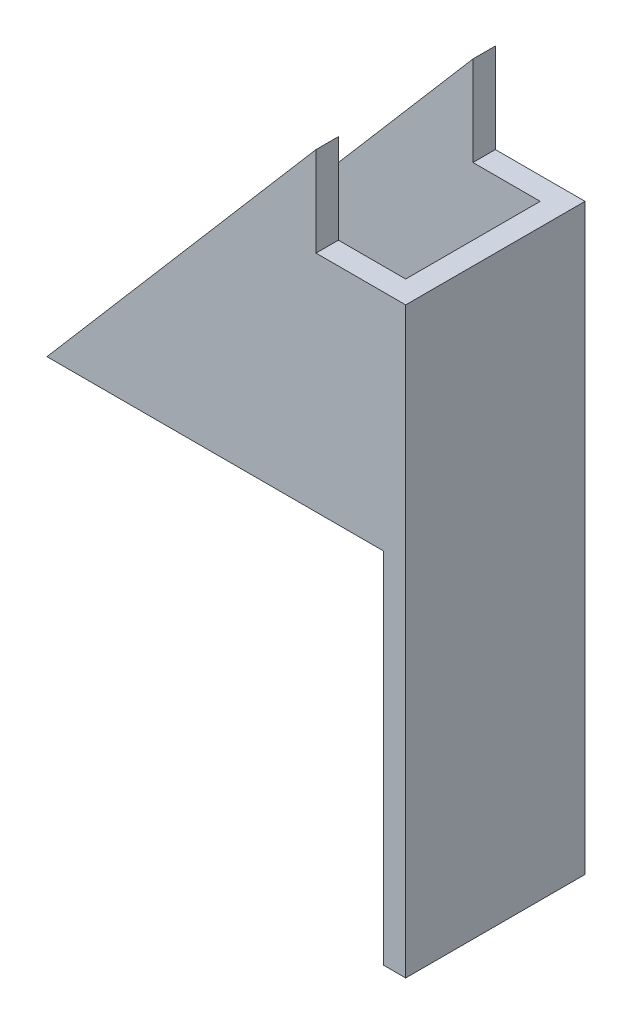
ISO-10303-21;
HEADER;
FILE_DESCRIPTION(('STEP AP214'),'2;1');
FILE_NAME('part.step','',(''),(''),'','','');
FILE_SCHEMA(('AUTOMOTIVE_DESIGN { 1 0 10303 214 1 1 1 1 }'));
ENDSEC;
DATA;
#1=APPLICATION_CONTEXT('core data for automotive mechanical design processes');
#2=APPLICATION_PROTOCOL_DEFINITION('international standard','automotive_design',2000,#1);
#3=PRODUCT_CONTEXT('',#1,'mechanical');
#4=PRODUCT('Part','Part','',(#3));
#5=PRODUCT_RELATED_PRODUCT_CATEGORY('part','',(#4));
#6=PRODUCT_DEFINITION_FORMATION('','',#4);
#7=PRODUCT_DEFINITION_CONTEXT('part definition',#1,'design');
#8=PRODUCT_DEFINITION('design','',#6,#7);
#9=PRODUCT_DEFINITION_SHAPE('','',#8);
#10=(LENGTH_UNIT() NAMED_UNIT(*) SI_UNIT(.MILLI.,.METRE.));
#11=(NAMED_UNIT(*) PLANE_ANGLE_UNIT() SI_UNIT($,.RADIAN.));
#12=(NAMED_UNIT(*) SI_UNIT($,.STERADIAN.) SOLID_ANGLE_UNIT());
#13=UNCERTAINTY_MEASURE_WITH_UNIT(LENGTH_MEASURE(1.E-05),#10,'distance_accuracy_value','');
#14=(GEOMETRIC_REPRESENTATION_CONTEXT(3) GLOBAL_UNCERTAINTY_ASSIGNED_CONTEXT((#13)) GLOBAL_UNIT_ASSIGNED_CONTEXT((#10,
#11,#12)) REPRESENTATION_CONTEXT('',''));
#15=CARTESIAN_POINT('',(0.,0.,0.));
#16=DIRECTION('',(0.,0.,1.));
#17=DIRECTION('',(1.,0.,0.));
#18=AXIS2_PLACEMENT_3D('',#15,#16,#17);
#19=CARTESIAN_POINT('',(9.525,44.45,12.7));
#20=DIRECTION('',(-1.,0.,0.));
#21=DIRECTION('',(0.,-1.,0.));
#22=AXIS2_PLACEMENT_3D('',#19,#20,#21);
#23=PLANE('',#22);
#24=DIRECTION('',(0.,0.,-1.));
#25=VECTOR('',#24,1.);
#26=CARTESIAN_POINT('',(9.525,31.75,12.7));
#27=LINE('',#26,#25);
#28=CARTESIAN_POINT('',(9.525,31.75,12.7));
#29=VERTEX_POINT('',#28);
#30=CARTESIAN_POINT('',(9.525,31.75,9.525));
#31=VERTEX_POINT('',#30);
#32=EDGE_CURVE('E41',#29,#31,#27,.T.);
#33=ORIENTED_EDGE('',*,*,#32,.T.);
#34=DIRECTION('',(0.,1.,0.));
#35=VECTOR('',#34,1.);
#36=CARTESIAN_POINT('',(9.525,44.45,9.525));
#37=LINE('',#36,#35);
#38=CARTESIAN_POINT('',(9.52500000000001,44.45,9.525));
#39=VERTEX_POINT('',#38);
#40=EDGE_CURVE('E166',#31,#39,#37,.T.);
#41=ORIENTED_EDGE('',*,*,#40,.T.);
#42=DIRECTION('',(0.,0.,-1.));
#43=VECTOR('',#42,1.);
#44=CARTESIAN_POINT('',(9.525,44.45,12.7));
#45=LINE('',#44,#43);
#46=CARTESIAN_POINT('',(9.525,44.45,12.7));
#47=VERTEX_POINT('',#46);
#48=EDGE_CURVE('E219',#47,#39,#45,.T.);
#49=ORIENTED_EDGE('',*,*,#48,.F.);
#50=DIRECTION('',(0.,1.,0.));
#51=VECTOR('',#50,1.);
#52=CARTESIAN_POINT('',(9.525,44.45,12.7));
#53=LINE('',#52,#51);
#54=EDGE_CURVE('E181',#29,#47,#53,.T.);
#55=ORIENTED_EDGE('',*,*,#54,.F.);
#56=EDGE_LOOP('',(#33,#41,#49,#55));
#57=FACE_BOUND('',#56,.T.);
#58=ADVANCED_FACE('F33',(#57),#23,.F.);
#59=CARTESIAN_POINT('',(22.225,31.75,12.7));
#60=DIRECTION('',(-1.,0.,0.));
#61=DIRECTION('',(0.,-1.,0.));
#62=AXIS2_PLACEMENT_3D('',#59,#60,#61);
#63=PLANE('',#62);
#64=DIRECTION('',(0.,1.,0.));
#65=VECTOR('',#64,1.);
#66=CARTESIAN_POINT('',(22.225,31.75,-12.7));
#67=LINE('',#66,#65);
#68=CARTESIAN_POINT('',(22.225,-50.8,-12.7));
#69=VERTEX_POINT('',#68);
#70=CARTESIAN_POINT('',(22.225,31.75,-12.7));
#71=VERTEX_POINT('',#70);
#72=EDGE_CURVE('E174',#69,#71,#67,.T.);
#73=ORIENTED_EDGE('',*,*,#72,.T.);
#74=DIRECTION('',(0.,0.,-1.));
#75=VECTOR('',#74,1.);
#76=CARTESIAN_POINT('',(22.225,31.75,12.7));
#77=LINE('',#76,#75);
#78=CARTESIAN_POINT('',(22.225,31.75,12.7));
#79=VERTEX_POINT('',#78);
#80=EDGE_CURVE('E11',#79,#71,#77,.T.);
#81=ORIENTED_EDGE('',*,*,#80,.F.);
#82=DIRECTION('',(0.,1.,0.));
#83=VECTOR('',#82,1.);
#84=CARTESIAN_POINT('',(22.225,31.75,12.7));
#85=LINE('',#84,#83);
#86=CARTESIAN_POINT('',(22.225,-50.8,12.7));
#87=VERTEX_POINT('',#86);
#88=EDGE_CURVE('E175',#87,#79,#85,.T.);
#89=ORIENTED_EDGE('',*,*,#88,.F.);
#90=DIRECTION('',(0.,0.,-1.));
#91=VECTOR('',#90,1.);
#92=CARTESIAN_POINT('',(22.225,-50.8,12.7));
#93=LINE('',#92,#91);
#94=EDGE_CURVE('E191',#87,#69,#93,.T.);
#95=ORIENTED_EDGE('',*,*,#94,.T.);
#96=EDGE_LOOP('',(#73,#81,#89,#95));
#97=FACE_BOUND('',#96,.T.);
#98=ADVANCED_FACE('F35',(#97),#63,.F.);
#99=CARTESIAN_POINT('',(22.225,31.75,12.7));
#100=DIRECTION('',(0.,-1.,0.));
#101=DIRECTION('',(0.,0.,-1.));
#102=AXIS2_PLACEMENT_3D('',#99,#100,#101);
#103=PLANE('',#102);
#104=DIRECTION('',(0.,0.,1.));
#105=VECTOR('',#104,1.);
#106=CARTESIAN_POINT('',(19.05,31.75,12.7));
#107=LINE('',#106,#105);
#108=CARTESIAN_POINT('',(19.05,31.75,-9.525));
#109=VERTEX_POINT('',#108);
#110=CARTESIAN_POINT('',(19.05,31.75,9.525));
#111=VERTEX_POINT('',#110);
#112=EDGE_CURVE('E160',#109,#111,#107,.T.);
#113=ORIENTED_EDGE('',*,*,#112,.T.);
#114=DIRECTION('',(-1.,0.,0.));
#115=VECTOR('',#114,1.);
#116=CARTESIAN_POINT('',(22.225,31.75,9.525));
#117=LINE('',#116,#115);
#118=EDGE_CURVE('E169',#111,#31,#117,.T.);
#119=ORIENTED_EDGE('',*,*,#118,.T.);
#120=ORIENTED_EDGE('',*,*,#32,.F.);
#121=DIRECTION('',(-1.,0.,0.));
#122=VECTOR('',#121,1.);
#123=CARTESIAN_POINT('',(22.225,31.75,12.7));
#124=LINE('',#123,#122);
#125=EDGE_CURVE('E178',#79,#29,#124,.T.);
#126=ORIENTED_EDGE('',*,*,#125,.F.);
#127=ORIENTED_EDGE('',*,*,#80,.T.);
#128=DIRECTION('',(-1.,0.,0.));
#129=VECTOR('',#128,1.);
#130=CARTESIAN_POINT('',(22.225,31.75,-12.7));
#131=LINE('',#130,#129);
#132=CARTESIAN_POINT('',(9.525,31.75,-12.7));
#133=VERTEX_POINT('',#132);
#134=EDGE_CURVE('E194',#71,#133,#131,.T.);
#135=ORIENTED_EDGE('',*,*,#134,.T.);
#136=CARTESIAN_POINT('',(9.525,31.75,-9.525));
#137=VERTEX_POINT('',#136);
#138=EDGE_CURVE('E221',#137,#133,#27,.T.);
#139=ORIENTED_EDGE('',*,*,#138,.F.);
#140=DIRECTION('',(1.,0.,0.));
#141=VECTOR('',#140,1.);
#142=CARTESIAN_POINT('',(22.225,31.75,-9.525));
#143=LINE('',#142,#141);
#144=EDGE_CURVE('E157',#137,#109,#143,.T.);
#145=ORIENTED_EDGE('',*,*,#144,.T.);
#146=EDGE_LOOP('',(#113,#119,#120,#126,#127,#135,#139,#145));
#147=FACE_BOUND('',#146,.T.);
#148=ADVANCED_FACE('F233',(#147),#103,.F.);
#149=CARTESIAN_POINT('',(9.525,44.45,-9.525));
#150=VERTEX_POINT('',#149);
#151=CARTESIAN_POINT('',(9.525,44.45,-12.7));
#152=VERTEX_POINT('',#151);
#153=EDGE_CURVE('E218',#150,#152,#45,.T.);
#154=ORIENTED_EDGE('',*,*,#153,.F.);
#155=DIRECTION('',(0.,-1.,0.));
#156=VECTOR('',#155,1.);
#157=CARTESIAN_POINT('',(9.525,44.45,-9.525));
#158=LINE('',#157,#156);
#159=EDGE_CURVE('E48',#150,#137,#158,.T.);
#160=ORIENTED_EDGE('',*,*,#159,.T.);
#161=ORIENTED_EDGE('',*,*,#138,.T.);
#162=DIRECTION('',(0.,1.,0.));
#163=VECTOR('',#162,1.);
#164=CARTESIAN_POINT('',(9.525,44.45,-12.7));
#165=LINE('',#164,#163);
#166=EDGE_CURVE('E197',#133,#152,#165,.T.);
#167=ORIENTED_EDGE('',*,*,#166,.T.);
#168=EDGE_LOOP('',(#154,#160,#161,#167));
#169=FACE_BOUND('',#168,.T.);
#170=ADVANCED_FACE('F229',(#169),#23,.F.);
#171=CARTESIAN_POINT('',(-28.575,0.,12.7));
#172=DIRECTION('',(0.759256602365296,-0.650791373455968,0.));
#173=DIRECTION('',(0.650791373455969,0.759256602365297,0.));
#174=AXIS2_PLACEMENT_3D('',#171,#172,#173);
#175=PLANE('',#174);
#176=ORIENTED_EDGE('',*,*,#48,.T.);
#177=DIRECTION('',(-0.650791373455969,-0.759256602365297,0.));
#178=VECTOR('',#177,1.);
#179=CARTESIAN_POINT('',(-28.575,0.,9.525));
#180=LINE('',#179,#178);
#181=CARTESIAN_POINT('',(-25.4,3.70416666666669,9.525));
#182=VERTEX_POINT('',#181);
#183=EDGE_CURVE('E163',#39,#182,#180,.T.);
#184=ORIENTED_EDGE('',*,*,#183,.T.);
#185=DIRECTION('',(0.,0.,-1.));
#186=VECTOR('',#185,1.);
#187=CARTESIAN_POINT('',(-25.4,3.70416666666667,12.7));
#188=LINE('',#187,#186);
#189=CARTESIAN_POINT('',(-25.4,3.70416666666669,-9.525));
#190=VERTEX_POINT('',#189);
#191=EDGE_CURVE('E172',#182,#190,#188,.T.);
#192=ORIENTED_EDGE('',*,*,#191,.T.);
#193=DIRECTION('',(0.650791373455969,0.759256602365297,0.));
#194=VECTOR('',#193,1.);
#195=CARTESIAN_POINT('',(-28.575,0.,-9.525));
#196=LINE('',#195,#194);
#197=EDGE_CURVE('E129',#190,#150,#196,.T.);
#198=ORIENTED_EDGE('',*,*,#197,.T.);
#199=ORIENTED_EDGE('',*,*,#153,.T.);
#200=DIRECTION('',(-0.650791373455968,-0.759256602365297,0.));
#201=VECTOR('',#200,1.);
#202=CARTESIAN_POINT('',(-28.575,0.,-12.7));
#203=LINE('',#202,#201);
#204=CARTESIAN_POINT('',(-28.575,0.,-12.7));
#205=VERTEX_POINT('',#204);
#206=EDGE_CURVE('E200',#152,#205,#203,.T.);
#207=ORIENTED_EDGE('',*,*,#206,.T.);
#208=DIRECTION('',(0.,0.,-1.));
#209=VECTOR('',#208,1.);
#210=CARTESIAN_POINT('',(-28.575,0.,12.7));
#211=LINE('',#210,#209);
#212=CARTESIAN_POINT('',(-28.575,0.,12.7));
#213=VERTEX_POINT('',#212);
#214=EDGE_CURVE('E215',#213,#205,#211,.T.);
#215=ORIENTED_EDGE('',*,*,#214,.F.);
#216=DIRECTION('',(-0.650791373455968,-0.759256602365297,0.));
#217=VECTOR('',#216,1.);
#218=CARTESIAN_POINT('',(-28.575,0.,12.7));
#219=LINE('',#218,#217);
#220=EDGE_CURVE('E183',#47,#213,#219,.T.);
#221=ORIENTED_EDGE('',*,*,#220,.F.);
#222=EDGE_LOOP('',(#176,#184,#192,#198,#199,#207,#215,#221));
#223=FACE_BOUND('',#222,.T.);
#224=ADVANCED_FACE('F242',(#223),#175,.F.);
#225=CARTESIAN_POINT('',(19.05,0.,12.7));
#226=DIRECTION('',(0.,1.,0.));
#227=DIRECTION('',(-1.,0.,0.));
#228=AXIS2_PLACEMENT_3D('',#225,#226,#227);
#229=PLANE('',#228);
#230=DIRECTION('',(0.,0.,-1.));
#231=VECTOR('',#230,1.);
#232=CARTESIAN_POINT('',(-25.4,0.,9.525));
#233=LINE('',#232,#231);
#234=CARTESIAN_POINT('',(-25.4,0.,9.525));
#235=VERTEX_POINT('',#234);
#236=CARTESIAN_POINT('',(-25.4,0.,-9.525));
#237=VERTEX_POINT('',#236);
#238=EDGE_CURVE('E136',#235,#237,#233,.T.);
#239=ORIENTED_EDGE('',*,*,#238,.F.);
#240=DIRECTION('',(-1.,0.,0.));
#241=VECTOR('',#240,1.);
#242=CARTESIAN_POINT('',(-25.4,0.,9.525));
#243=LINE('',#242,#241);
#244=CARTESIAN_POINT('',(19.05,0.,9.525));
#245=VERTEX_POINT('',#244);
#246=EDGE_CURVE('E133',#245,#235,#243,.T.);
#247=ORIENTED_EDGE('',*,*,#246,.F.);
#248=DIRECTION('',(0.,0.,-1.));
#249=VECTOR('',#248,1.);
#250=CARTESIAN_POINT('',(19.05,0.,12.7));
#251=LINE('',#250,#249);
#252=CARTESIAN_POINT('',(19.05,0.,12.7));
#253=VERTEX_POINT('',#252);
#254=EDGE_CURVE('E212',#253,#245,#251,.T.);
#255=ORIENTED_EDGE('',*,*,#254,.F.);
#256=DIRECTION('',(1.,0.,0.));
#257=VECTOR('',#256,1.);
#258=CARTESIAN_POINT('',(19.05,0.,12.7));
#259=LINE('',#258,#257);
#260=EDGE_CURVE('E185',#213,#253,#259,.T.);
#261=ORIENTED_EDGE('',*,*,#260,.F.);
#262=ORIENTED_EDGE('',*,*,#214,.T.);
#263=DIRECTION('',(1.,0.,0.));
#264=VECTOR('',#263,1.);
#265=CARTESIAN_POINT('',(19.05,0.,-12.7));
#266=LINE('',#265,#264);
#267=CARTESIAN_POINT('',(19.05,0.,-12.7));
#268=VERTEX_POINT('',#267);
#269=EDGE_CURVE('E202',#205,#268,#266,.T.);
#270=ORIENTED_EDGE('',*,*,#269,.T.);
#271=CARTESIAN_POINT('',(19.05,0.,-9.525));
#272=VERTEX_POINT('',#271);
#273=EDGE_CURVE('E147',#272,#268,#251,.T.);
#274=ORIENTED_EDGE('',*,*,#273,.F.);
#275=DIRECTION('',(1.,0.,0.));
#276=VECTOR('',#275,1.);
#277=CARTESIAN_POINT('',(-25.4,0.,-9.525));
#278=LINE('',#277,#276);
#279=EDGE_CURVE('E55',#237,#272,#278,.T.);
#280=ORIENTED_EDGE('',*,*,#279,.F.);
#281=EDGE_LOOP('',(#239,#247,#255,#261,#262,#270,#274,#280));
#282=FACE_BOUND('',#281,.T.);
#283=ADVANCED_FACE('F145',(#282),#229,.F.);
#284=CARTESIAN_POINT('',(19.05,-50.8,12.7));
#285=DIRECTION('',(1.,0.,0.));
#286=DIRECTION('',(0.,0.,-1.));
#287=AXIS2_PLACEMENT_3D('',#284,#285,#286);
#288=PLANE('',#287);
#289=DIRECTION('',(0.,-1.,0.));
#290=VECTOR('',#289,1.);
#291=CARTESIAN_POINT('',(19.05,-50.8,-12.7));
#292=LINE('',#291,#290);
#293=CARTESIAN_POINT('',(19.05,-50.8,-12.7));
#294=VERTEX_POINT('',#293);
#295=EDGE_CURVE('E204',#268,#294,#292,.T.);
#296=ORIENTED_EDGE('',*,*,#295,.T.);
#297=DIRECTION('',(0.,0.,-1.));
#298=VECTOR('',#297,1.);
#299=CARTESIAN_POINT('',(19.05,-50.8,12.7));
#300=LINE('',#299,#298);
#301=CARTESIAN_POINT('',(19.05,-50.8,12.7));
#302=VERTEX_POINT('',#301);
#303=EDGE_CURVE('E209',#302,#294,#300,.T.);
#304=ORIENTED_EDGE('',*,*,#303,.F.);
#305=DIRECTION('',(0.,-1.,0.));
#306=VECTOR('',#305,1.);
#307=CARTESIAN_POINT('',(19.05,-50.8,12.7));
#308=LINE('',#307,#306);
#309=EDGE_CURVE('E187',#253,#302,#308,.T.);
#310=ORIENTED_EDGE('',*,*,#309,.F.);
#311=ORIENTED_EDGE('',*,*,#254,.T.);
#312=DIRECTION('',(0.,-1.,0.));
#313=VECTOR('',#312,1.);
#314=CARTESIAN_POINT('',(19.05,44.45,9.525));
#315=LINE('',#314,#313);
#316=EDGE_CURVE('E152',#111,#245,#315,.T.);
#317=ORIENTED_EDGE('',*,*,#316,.F.);
#318=ORIENTED_EDGE('',*,*,#112,.F.);
#319=DIRECTION('',(0.,-1.,0.));
#320=VECTOR('',#319,1.);
#321=CARTESIAN_POINT('',(19.05,44.45,-9.525));
#322=LINE('',#321,#320);
#323=EDGE_CURVE('E132',#109,#272,#322,.T.);
#324=ORIENTED_EDGE('',*,*,#323,.T.);
#325=ORIENTED_EDGE('',*,*,#273,.T.);
#326=EDGE_LOOP('',(#296,#304,#310,#311,#317,#318,#324,#325));
#327=FACE_BOUND('',#326,.T.);
#328=ADVANCED_FACE('F255',(#327),#288,.F.);
#329=CARTESIAN_POINT('',(19.05,-50.8,12.7));
#330=DIRECTION('',(0.,1.,0.));
#331=DIRECTION('',(0.,0.,1.));
#332=AXIS2_PLACEMENT_3D('',#329,#330,#331);
#333=PLANE('',#332);
#334=DIRECTION('',(1.,0.,0.));
#335=VECTOR('',#334,1.);
#336=CARTESIAN_POINT('',(19.05,-50.8,-12.7));
#337=LINE('',#336,#335);
#338=EDGE_CURVE('E179',#294,#69,#337,.T.);
#339=ORIENTED_EDGE('',*,*,#338,.T.);
#340=ORIENTED_EDGE('',*,*,#94,.F.);
#341=DIRECTION('',(1.,0.,0.));
#342=VECTOR('',#341,1.);
#343=CARTESIAN_POINT('',(19.05,-50.8,12.7));
#344=LINE('',#343,#342);
#345=EDGE_CURVE('E189',#302,#87,#344,.T.);
#346=ORIENTED_EDGE('',*,*,#345,.F.);
#347=ORIENTED_EDGE('',*,*,#303,.T.);
#348=EDGE_LOOP('',(#339,#340,#346,#347));
#349=FACE_BOUND('',#348,.T.);
#350=ADVANCED_FACE('F260',(#349),#333,.F.);
#351=CARTESIAN_POINT('',(0.,0.,12.7));
#352=DIRECTION('',(0.,0.,1.));
#353=DIRECTION('',(1.,0.,0.));
#354=AXIS2_PLACEMENT_3D('',#351,#352,#353);
#355=PLANE('',#354);
#356=ORIENTED_EDGE('',*,*,#88,.T.);
#357=ORIENTED_EDGE('',*,*,#125,.T.);
#358=ORIENTED_EDGE('',*,*,#54,.T.);
#359=ORIENTED_EDGE('',*,*,#220,.T.);
#360=ORIENTED_EDGE('',*,*,#260,.T.);
#361=ORIENTED_EDGE('',*,*,#309,.T.);
#362=ORIENTED_EDGE('',*,*,#345,.T.);
#363=EDGE_LOOP('',(#356,#357,#358,#359,#360,#361,#362));
#364=FACE_BOUND('',#363,.T.);
#365=ADVANCED_FACE('F248',(#364),#355,.T.);
#366=CARTESIAN_POINT('',(0.,0.,-12.7));
#367=DIRECTION('',(0.,0.,1.));
#368=DIRECTION('',(1.,0.,0.));
#369=AXIS2_PLACEMENT_3D('',#366,#367,#368);
#370=PLANE('',#369);
#371=ORIENTED_EDGE('',*,*,#72,.F.);
#372=ORIENTED_EDGE('',*,*,#338,.F.);
#373=ORIENTED_EDGE('',*,*,#295,.F.);
#374=ORIENTED_EDGE('',*,*,#269,.F.);
#375=ORIENTED_EDGE('',*,*,#206,.F.);
#376=ORIENTED_EDGE('',*,*,#166,.F.);
#377=ORIENTED_EDGE('',*,*,#134,.F.);
#378=EDGE_LOOP('',(#371,#372,#373,#374,#375,#376,#377));
#379=FACE_BOUND('',#378,.T.);
#380=ADVANCED_FACE('F237',(#379),#370,.F.);
#381=CARTESIAN_POINT('',(-25.4,44.45,9.525));
#382=DIRECTION('',(-1.,0.,0.));
#383=DIRECTION('',(0.,-1.,0.));
#384=AXIS2_PLACEMENT_3D('',#381,#382,#383);
#385=PLANE('',#384);
#386=DIRECTION('',(0.,-1.,0.));
#387=VECTOR('',#386,1.);
#388=CARTESIAN_POINT('',(-25.4,44.45,9.525));
#389=LINE('',#388,#387);
#390=EDGE_CURVE('E139',#182,#235,#389,.T.);
#391=ORIENTED_EDGE('',*,*,#390,.T.);
#392=ORIENTED_EDGE('',*,*,#238,.T.);
#393=DIRECTION('',(0.,-1.,0.));
#394=VECTOR('',#393,1.);
#395=CARTESIAN_POINT('',(-25.4,44.45,-9.525));
#396=LINE('',#395,#394);
#397=EDGE_CURVE('E126',#190,#237,#396,.T.);
#398=ORIENTED_EDGE('',*,*,#397,.F.);
#399=ORIENTED_EDGE('',*,*,#191,.F.);
#400=EDGE_LOOP('',(#391,#392,#398,#399));
#401=FACE_BOUND('',#400,.T.);
#402=ADVANCED_FACE('F137',(#401),#385,.F.);
#403=CARTESIAN_POINT('',(-25.4,44.45,9.525));
#404=DIRECTION('',(0.,0.,1.));
#405=DIRECTION('',(1.,0.,0.));
#406=AXIS2_PLACEMENT_3D('',#403,#404,#405);
#407=PLANE('',#406);
#408=ORIENTED_EDGE('',*,*,#316,.T.);
#409=ORIENTED_EDGE('',*,*,#246,.T.);
#410=ORIENTED_EDGE('',*,*,#390,.F.);
#411=ORIENTED_EDGE('',*,*,#183,.F.);
#412=ORIENTED_EDGE('',*,*,#40,.F.);
#413=ORIENTED_EDGE('',*,*,#118,.F.);
#414=EDGE_LOOP('',(#408,#409,#410,#411,#412,#413));
#415=FACE_BOUND('',#414,.T.);
#416=ADVANCED_FACE('F252',(#415),#407,.F.);
#417=CARTESIAN_POINT('',(-25.4,44.45,-9.525));
#418=DIRECTION('',(0.,0.,-1.));
#419=DIRECTION('',(-1.,0.,0.));
#420=AXIS2_PLACEMENT_3D('',#417,#418,#419);
#421=PLANE('',#420);
#422=ORIENTED_EDGE('',*,*,#159,.F.);
#423=ORIENTED_EDGE('',*,*,#197,.F.);
#424=ORIENTED_EDGE('',*,*,#397,.T.);
#425=ORIENTED_EDGE('',*,*,#279,.T.);
#426=ORIENTED_EDGE('',*,*,#323,.F.);
#427=ORIENTED_EDGE('',*,*,#144,.F.);
#428=EDGE_LOOP('',(#422,#423,#424,#425,#426,#427));
#429=FACE_BOUND('',#428,.T.);
#430=ADVANCED_FACE('F128',(#429),#421,.F.);
#431=CLOSED_SHELL('',(#58,#98,#148,#170,#224,#283,#328,#350,#365,#380,#402,#416,#430));
#432=MANIFOLD_SOLID_BREP('B2',#431);
#433=ADVANCED_BREP_SHAPE_REPRESENTATION('',(#18,#432),#14);
#434=SHAPE_DEFINITION_REPRESENTATION(#9,#433);
ENDSEC;
END-ISO-10303-21;
